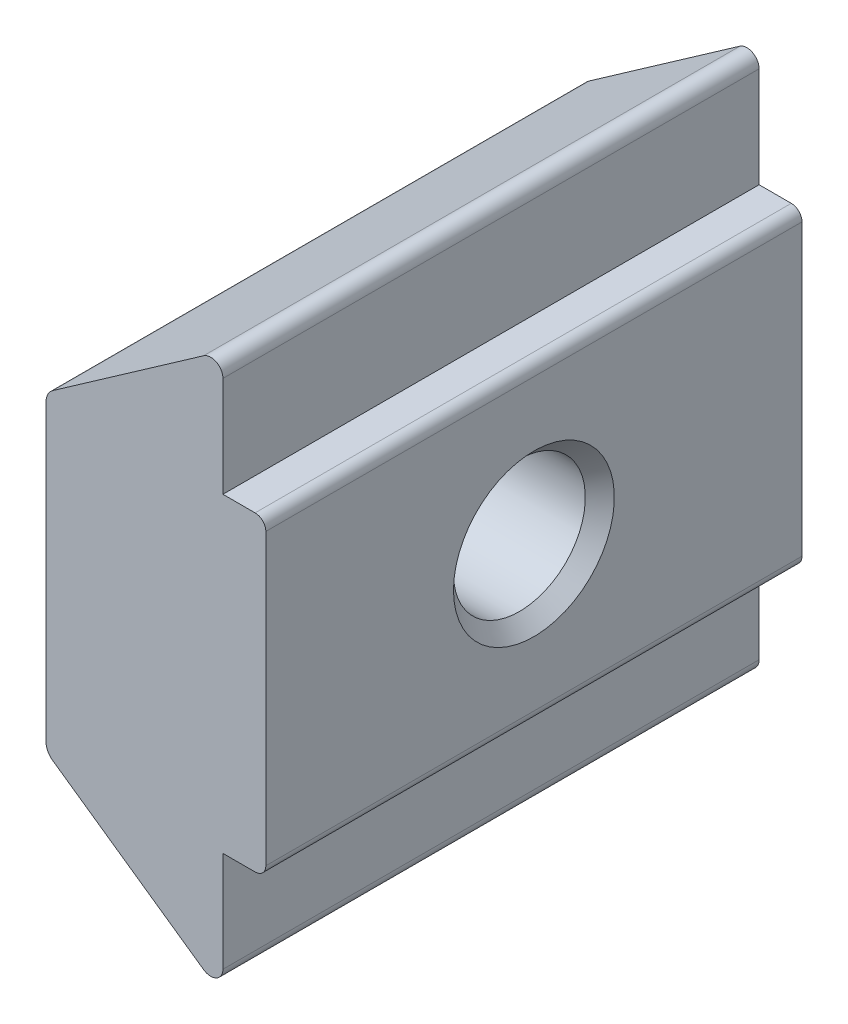
ISO-10303-21;
HEADER;
FILE_DESCRIPTION(('STEP AP214'),'2;1');
FILE_NAME('part.step','',(''),(''),'','','');
FILE_SCHEMA(('AUTOMOTIVE_DESIGN { 1 0 10303 214 1 1 1 1 }'));
ENDSEC;
DATA;
#1=APPLICATION_CONTEXT('core data for automotive mechanical design processes');
#2=APPLICATION_PROTOCOL_DEFINITION('international standard','automotive_design',2000,#1);
#3=PRODUCT_CONTEXT('',#1,'mechanical');
#4=PRODUCT('Part','Part','',(#3));
#5=PRODUCT_RELATED_PRODUCT_CATEGORY('part','',(#4));
#6=PRODUCT_DEFINITION_FORMATION('','',#4);
#7=PRODUCT_DEFINITION_CONTEXT('part definition',#1,'design');
#8=PRODUCT_DEFINITION('design','',#6,#7);
#9=PRODUCT_DEFINITION_SHAPE('','',#8);
#10=(LENGTH_UNIT() NAMED_UNIT(*) SI_UNIT(.MILLI.,.METRE.));
#11=(NAMED_UNIT(*) PLANE_ANGLE_UNIT() SI_UNIT($,.RADIAN.));
#12=(NAMED_UNIT(*) SI_UNIT($,.STERADIAN.) SOLID_ANGLE_UNIT());
#13=UNCERTAINTY_MEASURE_WITH_UNIT(LENGTH_MEASURE(1.E-05),#10,'distance_accuracy_value','');
#14=(GEOMETRIC_REPRESENTATION_CONTEXT(3) GLOBAL_UNCERTAINTY_ASSIGNED_CONTEXT((#13)) GLOBAL_UNIT_ASSIGNED_CONTEXT((#10,
#11,#12)) REPRESENTATION_CONTEXT('',''));
#15=CARTESIAN_POINT('',(0.,0.,0.));
#16=DIRECTION('',(0.,0.,1.));
#17=DIRECTION('',(1.,0.,0.));
#18=AXIS2_PLACEMENT_3D('',#15,#16,#17);
#19=CARTESIAN_POINT('',(-3.80000000000035,-2.74380333152817,5.));
#20=DIRECTION('',(0.,0.,-1.));
#21=DIRECTION('',(-1.,0.,0.));
#22=AXIS2_PLACEMENT_3D('',#19,#20,#21);
#23=CYLINDRICAL_SURFACE('',#22,0.299999999999655);
#24=DIRECTION('',(0.,0.,-1.));
#25=VECTOR('',#24,1.);
#26=CARTESIAN_POINT('',(-4.1,-2.743803331528,5.));
#27=LINE('',#26,#25);
#28=CARTESIAN_POINT('',(-4.1,-2.743803331528,5.));
#29=VERTEX_POINT('',#28);
#30=CARTESIAN_POINT('',(-4.1,-2.743803331528,-5.));
#31=VERTEX_POINT('',#30);
#32=EDGE_CURVE('E152',#29,#31,#27,.T.);
#33=ORIENTED_EDGE('',*,*,#32,.T.);
#34=CARTESIAN_POINT('',(-3.80000000000035,-2.74380333152817,-5.));
#35=DIRECTION('',(0.,0.,1.));
#36=DIRECTION('',(1.,0.,0.));
#37=AXIS2_PLACEMENT_3D('',#34,#35,#36);
#38=CIRCLE('',#37,0.299999999999655);
#39=CARTESIAN_POINT('',(-3.972038703309,-2.9895729076837,-5.));
#40=VERTEX_POINT('',#39);
#41=EDGE_CURVE('E146',#31,#40,#38,.T.);
#42=ORIENTED_EDGE('',*,*,#41,.T.);
#43=DIRECTION('',(0.,0.,-1.));
#44=VECTOR('',#43,1.);
#45=CARTESIAN_POINT('',(-3.972038703309,-2.9895729076837,5.));
#46=LINE('',#45,#44);
#47=CARTESIAN_POINT('',(-3.972038703309,-2.9895729076837,5.));
#48=VERTEX_POINT('',#47);
#49=EDGE_CURVE('E11',#48,#40,#46,.T.);
#50=ORIENTED_EDGE('',*,*,#49,.F.);
#51=CARTESIAN_POINT('',(-3.80000000000035,-2.74380333152817,5.));
#52=DIRECTION('',(0.,0.,1.));
#53=DIRECTION('',(1.,0.,0.));
#54=AXIS2_PLACEMENT_3D('',#51,#52,#53);
#55=CIRCLE('',#54,0.299999999999655);
#56=EDGE_CURVE('E193',#29,#48,#55,.T.);
#57=ORIENTED_EDGE('',*,*,#56,.F.);
#58=EDGE_LOOP('',(#33,#42,#50,#57));
#59=FACE_BOUND('',#58,.T.);
#60=ADVANCED_FACE('F34',(#59),#23,.T.);
#61=CARTESIAN_POINT('',(-3.972038703309,-2.9895729076837,5.));
#62=DIRECTION('',(0.573462344363338,0.819231920519034,0.));
#63=DIRECTION('',(-0.819231920519034,0.573462344363338,0.));
#64=AXIS2_PLACEMENT_3D('',#61,#62,#63);
#65=PLANE('',#64);
#66=ORIENTED_EDGE('',*,*,#49,.T.);
#67=DIRECTION('',(0.819231920519034,-0.573462344363338,0.));
#68=VECTOR('',#67,1.);
#69=CARTESIAN_POINT('',(-3.972038703309,-2.9895729076837,-5.));
#70=LINE('',#69,#68);
#71=CARTESIAN_POINT('',(-1.1589060402685,-4.9587657718121,-5.));
#72=VERTEX_POINT('',#71);
#73=EDGE_CURVE('E136',#40,#72,#70,.T.);
#74=ORIENTED_EDGE('',*,*,#73,.T.);
#75=DIRECTION('',(0.,0.,-1.));
#76=VECTOR('',#75,1.);
#77=CARTESIAN_POINT('',(-1.1589060402685,-4.9587657718121,5.));
#78=LINE('',#77,#76);
#79=CARTESIAN_POINT('',(-1.1589060402685,-4.9587657718121,5.));
#80=VERTEX_POINT('',#79);
#81=EDGE_CURVE('E41',#80,#72,#78,.T.);
#82=ORIENTED_EDGE('',*,*,#81,.F.);
#83=DIRECTION('',(0.819231920519034,-0.573462344363338,0.));
#84=VECTOR('',#83,1.);
#85=CARTESIAN_POINT('',(-3.972038703309,-2.9895729076837,5.));
#86=LINE('',#85,#84);
#87=EDGE_CURVE('E137',#48,#80,#86,.T.);
#88=ORIENTED_EDGE('',*,*,#87,.F.);
#89=EDGE_LOOP('',(#66,#74,#82,#88));
#90=FACE_BOUND('',#89,.T.);
#91=ADVANCED_FACE('F134',(#90),#65,.F.);
#92=CARTESIAN_POINT('',(-1.02809999999485,-4.77189846641082,5.));
#93=DIRECTION('',(0.,0.,-1.));
#94=DIRECTION('',(-1.,0.,0.));
#95=AXIS2_PLACEMENT_3D('',#92,#93,#94);
#96=CYLINDRICAL_SURFACE('',#95,0.228100000000009);
#97=ORIENTED_EDGE('',*,*,#81,.T.);
#98=CARTESIAN_POINT('',(-1.02809999999485,-4.77189846641082,-5.));
#99=DIRECTION('',(0.,0.,1.));
#100=DIRECTION('',(1.,0.,0.));
#101=AXIS2_PLACEMENT_3D('',#98,#99,#100);
#102=CIRCLE('',#101,0.228100000000009);
#103=CARTESIAN_POINT('',(-0.8,-4.7719,-5.));
#104=VERTEX_POINT('',#103);
#105=EDGE_CURVE('E150',#72,#104,#102,.T.);
#106=ORIENTED_EDGE('',*,*,#105,.T.);
#107=DIRECTION('',(0.,0.,-1.));
#108=VECTOR('',#107,1.);
#109=CARTESIAN_POINT('',(-0.8,-4.7719,5.));
#110=LINE('',#109,#108);
#111=CARTESIAN_POINT('',(-0.8,-4.7719,5.));
#112=VERTEX_POINT('',#111);
#113=EDGE_CURVE('E239',#112,#104,#110,.T.);
#114=ORIENTED_EDGE('',*,*,#113,.F.);
#115=CARTESIAN_POINT('',(-1.02809999999485,-4.77189846641082,5.));
#116=DIRECTION('',(0.,0.,1.));
#117=DIRECTION('',(1.,0.,0.));
#118=AXIS2_PLACEMENT_3D('',#115,#116,#117);
#119=CIRCLE('',#118,0.228100000000009);
#120=EDGE_CURVE('E196',#80,#112,#119,.T.);
#121=ORIENTED_EDGE('',*,*,#120,.F.);
#122=EDGE_LOOP('',(#97,#106,#114,#121));
#123=FACE_BOUND('',#122,.T.);
#124=ADVANCED_FACE('F242',(#123),#96,.T.);
#125=CARTESIAN_POINT('',(-0.8,-4.7719,5.));
#126=DIRECTION('',(-1.,0.,0.));
#127=DIRECTION('',(0.,0.,1.));
#128=AXIS2_PLACEMENT_3D('',#125,#126,#127);
#129=PLANE('',#128);
#130=ORIENTED_EDGE('',*,*,#113,.T.);
#131=DIRECTION('',(0.,1.,0.));
#132=VECTOR('',#131,1.);
#133=CARTESIAN_POINT('',(-0.8,-4.7719,-5.));
#134=LINE('',#133,#132);
#135=CARTESIAN_POINT('',(-0.8,-2.9,-5.));
#136=VERTEX_POINT('',#135);
#137=EDGE_CURVE('E161',#104,#136,#134,.T.);
#138=ORIENTED_EDGE('',*,*,#137,.T.);
#139=DIRECTION('',(0.,0.,-1.));
#140=VECTOR('',#139,1.);
#141=CARTESIAN_POINT('',(-0.8,-2.9,5.));
#142=LINE('',#141,#140);
#143=CARTESIAN_POINT('',(-0.8,-2.9,5.));
#144=VERTEX_POINT('',#143);
#145=EDGE_CURVE('E237',#144,#136,#142,.T.);
#146=ORIENTED_EDGE('',*,*,#145,.F.);
#147=DIRECTION('',(0.,1.,0.));
#148=VECTOR('',#147,1.);
#149=CARTESIAN_POINT('',(-0.8,-4.7719,5.));
#150=LINE('',#149,#148);
#151=EDGE_CURVE('E198',#112,#144,#150,.T.);
#152=ORIENTED_EDGE('',*,*,#151,.F.);
#153=EDGE_LOOP('',(#130,#138,#146,#152));
#154=FACE_BOUND('',#153,.T.);
#155=ADVANCED_FACE('F250',(#154),#129,.F.);
#156=CARTESIAN_POINT('',(-0.8,-2.9,5.));
#157=DIRECTION('',(0.,1.,0.));
#158=DIRECTION('',(0.,0.,1.));
#159=AXIS2_PLACEMENT_3D('',#156,#157,#158);
#160=PLANE('',#159);
#161=ORIENTED_EDGE('',*,*,#145,.T.);
#162=DIRECTION('',(1.,0.,0.));
#163=VECTOR('',#162,1.);
#164=CARTESIAN_POINT('',(-0.8,-2.9,-5.));
#165=LINE('',#164,#163);
#166=CARTESIAN_POINT('',(-0.2,-2.9,-5.));
#167=VERTEX_POINT('',#166);
#168=EDGE_CURVE('E164',#136,#167,#165,.T.);
#169=ORIENTED_EDGE('',*,*,#168,.T.);
#170=DIRECTION('',(0.,0.,-1.));
#171=VECTOR('',#170,1.);
#172=CARTESIAN_POINT('',(-0.2,-2.9,5.));
#173=LINE('',#172,#171);
#174=CARTESIAN_POINT('',(-0.2,-2.9,5.));
#175=VERTEX_POINT('',#174);
#176=EDGE_CURVE('E235',#175,#167,#173,.T.);
#177=ORIENTED_EDGE('',*,*,#176,.F.);
#178=DIRECTION('',(1.,0.,0.));
#179=VECTOR('',#178,1.);
#180=CARTESIAN_POINT('',(-0.8,-2.9,5.));
#181=LINE('',#180,#179);
#182=EDGE_CURVE('E200',#144,#175,#181,.T.);
#183=ORIENTED_EDGE('',*,*,#182,.F.);
#184=EDGE_LOOP('',(#161,#169,#177,#183));
#185=FACE_BOUND('',#184,.T.);
#186=ADVANCED_FACE('F253',(#185),#160,.F.);
#187=CARTESIAN_POINT('',(-0.200000000000016,-2.69999999999998,5.));
#188=DIRECTION('',(0.,0.,-1.));
#189=DIRECTION('',(-1.,0.,0.));
#190=AXIS2_PLACEMENT_3D('',#187,#188,#189);
#191=CYLINDRICAL_SURFACE('',#190,0.200000000000016);
#192=ORIENTED_EDGE('',*,*,#176,.T.);
#193=CARTESIAN_POINT('',(-0.200000000000016,-2.69999999999998,-5.));
#194=DIRECTION('',(0.,0.,1.));
#195=DIRECTION('',(1.,0.,0.));
#196=AXIS2_PLACEMENT_3D('',#193,#194,#195);
#197=CIRCLE('',#196,0.200000000000016);
#198=CARTESIAN_POINT('',(0.,-2.7,-5.));
#199=VERTEX_POINT('',#198);
#200=EDGE_CURVE('E167',#167,#199,#197,.T.);
#201=ORIENTED_EDGE('',*,*,#200,.T.);
#202=DIRECTION('',(0.,0.,-1.));
#203=VECTOR('',#202,1.);
#204=CARTESIAN_POINT('',(0.,-2.7,5.));
#205=LINE('',#204,#203);
#206=CARTESIAN_POINT('',(0.,-2.7,5.));
#207=VERTEX_POINT('',#206);
#208=EDGE_CURVE('E233',#207,#199,#205,.T.);
#209=ORIENTED_EDGE('',*,*,#208,.F.);
#210=CARTESIAN_POINT('',(-0.200000000000016,-2.69999999999998,5.));
#211=DIRECTION('',(0.,0.,1.));
#212=DIRECTION('',(1.,0.,0.));
#213=AXIS2_PLACEMENT_3D('',#210,#211,#212);
#214=CIRCLE('',#213,0.200000000000016);
#215=EDGE_CURVE('E202',#175,#207,#214,.T.);
#216=ORIENTED_EDGE('',*,*,#215,.F.);
#217=EDGE_LOOP('',(#192,#201,#209,#216));
#218=FACE_BOUND('',#217,.T.);
#219=ADVANCED_FACE('F258',(#218),#191,.T.);
#220=CARTESIAN_POINT('',(0.,-2.7,5.));
#221=DIRECTION('',(-1.,0.,0.));
#222=DIRECTION('',(0.,0.,1.));
#223=AXIS2_PLACEMENT_3D('',#220,#221,#222);
#224=PLANE('',#223);
#225=CARTESIAN_POINT('',(0.,0.,0.));
#226=DIRECTION('',(-1.,0.,0.));
#227=DIRECTION('',(0.,0.,1.));
#228=AXIS2_PLACEMENT_3D('',#225,#226,#227);
#229=CIRCLE('',#228,1.5);
#230=CARTESIAN_POINT('',(0.,0.,1.5));
#231=VERTEX_POINT('',#230);
#232=EDGE_CURVE('E407',#231,#231,#229,.T.);
#233=ORIENTED_EDGE('',*,*,#232,.T.);
#234=EDGE_LOOP('',(#233));
#235=FACE_BOUND('',#234,.T.);
#236=ORIENTED_EDGE('',*,*,#208,.T.);
#237=DIRECTION('',(0.,1.,0.));
#238=VECTOR('',#237,1.);
#239=CARTESIAN_POINT('',(0.,-2.7,-5.));
#240=LINE('',#239,#238);
#241=CARTESIAN_POINT('',(0.,2.7,-5.));
#242=VERTEX_POINT('',#241);
#243=EDGE_CURVE('E170',#199,#242,#240,.T.);
#244=ORIENTED_EDGE('',*,*,#243,.T.);
#245=DIRECTION('',(0.,0.,-1.));
#246=VECTOR('',#245,1.);
#247=CARTESIAN_POINT('',(0.,2.7,5.));
#248=LINE('',#247,#246);
#249=CARTESIAN_POINT('',(0.,2.7,5.));
#250=VERTEX_POINT('',#249);
#251=EDGE_CURVE('E231',#250,#242,#248,.T.);
#252=ORIENTED_EDGE('',*,*,#251,.F.);
#253=DIRECTION('',(0.,1.,0.));
#254=VECTOR('',#253,1.);
#255=CARTESIAN_POINT('',(0.,-2.7,5.));
#256=LINE('',#255,#254);
#257=EDGE_CURVE('E204',#207,#250,#256,.T.);
#258=ORIENTED_EDGE('',*,*,#257,.F.);
#259=EDGE_LOOP('',(#236,#244,#252,#258));
#260=FACE_BOUND('',#259,.T.);
#261=ADVANCED_FACE('F264',(#235,#260),#224,.F.);
#262=CARTESIAN_POINT('',(-0.200000000000016,2.69999999999998,5.));
#263=DIRECTION('',(0.,0.,-1.));
#264=DIRECTION('',(-1.,0.,0.));
#265=AXIS2_PLACEMENT_3D('',#262,#263,#264);
#266=CYLINDRICAL_SURFACE('',#265,0.200000000000016);
#267=ORIENTED_EDGE('',*,*,#251,.T.);
#268=CARTESIAN_POINT('',(-0.200000000000016,2.69999999999998,-5.));
#269=DIRECTION('',(0.,0.,1.));
#270=DIRECTION('',(1.,0.,0.));
#271=AXIS2_PLACEMENT_3D('',#268,#269,#270);
#272=CIRCLE('',#271,0.200000000000016);
#273=CARTESIAN_POINT('',(-0.2,2.9,-5.));
#274=VERTEX_POINT('',#273);
#275=EDGE_CURVE('E173',#242,#274,#272,.T.);
#276=ORIENTED_EDGE('',*,*,#275,.T.);
#277=DIRECTION('',(0.,0.,-1.));
#278=VECTOR('',#277,1.);
#279=CARTESIAN_POINT('',(-0.2,2.9,5.));
#280=LINE('',#279,#278);
#281=CARTESIAN_POINT('',(-0.2,2.9,5.));
#282=VERTEX_POINT('',#281);
#283=EDGE_CURVE('E229',#282,#274,#280,.T.);
#284=ORIENTED_EDGE('',*,*,#283,.F.);
#285=CARTESIAN_POINT('',(-0.200000000000016,2.69999999999998,5.));
#286=DIRECTION('',(0.,0.,1.));
#287=DIRECTION('',(1.,0.,0.));
#288=AXIS2_PLACEMENT_3D('',#285,#286,#287);
#289=CIRCLE('',#288,0.200000000000016);
#290=EDGE_CURVE('E206',#250,#282,#289,.T.);
#291=ORIENTED_EDGE('',*,*,#290,.F.);
#292=EDGE_LOOP('',(#267,#276,#284,#291));
#293=FACE_BOUND('',#292,.T.);
#294=ADVANCED_FACE('F268',(#293),#266,.T.);
#295=CARTESIAN_POINT('',(-0.2,2.9,5.));
#296=DIRECTION('',(0.,-1.,0.));
#297=DIRECTION('',(0.,0.,-1.));
#298=AXIS2_PLACEMENT_3D('',#295,#296,#297);
#299=PLANE('',#298);
#300=ORIENTED_EDGE('',*,*,#283,.T.);
#301=DIRECTION('',(-1.,0.,0.));
#302=VECTOR('',#301,1.);
#303=CARTESIAN_POINT('',(-0.2,2.9,-5.));
#304=LINE('',#303,#302);
#305=CARTESIAN_POINT('',(-0.8,2.9,-5.));
#306=VERTEX_POINT('',#305);
#307=EDGE_CURVE('E176',#274,#306,#304,.T.);
#308=ORIENTED_EDGE('',*,*,#307,.T.);
#309=DIRECTION('',(0.,0.,-1.));
#310=VECTOR('',#309,1.);
#311=CARTESIAN_POINT('',(-0.8,2.9,5.));
#312=LINE('',#311,#310);
#313=CARTESIAN_POINT('',(-0.8,2.9,5.));
#314=VERTEX_POINT('',#313);
#315=EDGE_CURVE('E227',#314,#306,#312,.T.);
#316=ORIENTED_EDGE('',*,*,#315,.F.);
#317=DIRECTION('',(-1.,0.,0.));
#318=VECTOR('',#317,1.);
#319=CARTESIAN_POINT('',(-0.2,2.9,5.));
#320=LINE('',#319,#318);
#321=EDGE_CURVE('E208',#282,#314,#320,.T.);
#322=ORIENTED_EDGE('',*,*,#321,.F.);
#323=EDGE_LOOP('',(#300,#308,#316,#322));
#324=FACE_BOUND('',#323,.T.);
#325=ADVANCED_FACE('F273',(#324),#299,.F.);
#326=CARTESIAN_POINT('',(-0.8,2.9,5.));
#327=DIRECTION('',(-1.,0.,0.));
#328=DIRECTION('',(0.,0.,1.));
#329=AXIS2_PLACEMENT_3D('',#326,#327,#328);
#330=PLANE('',#329);
#331=ORIENTED_EDGE('',*,*,#315,.T.);
#332=DIRECTION('',(0.,1.,0.));
#333=VECTOR('',#332,1.);
#334=CARTESIAN_POINT('',(-0.8,2.9,-5.));
#335=LINE('',#334,#333);
#336=CARTESIAN_POINT('',(-0.8,4.7719,-5.));
#337=VERTEX_POINT('',#336);
#338=EDGE_CURVE('E179',#306,#337,#335,.T.);
#339=ORIENTED_EDGE('',*,*,#338,.T.);
#340=DIRECTION('',(0.,0.,-1.));
#341=VECTOR('',#340,1.);
#342=CARTESIAN_POINT('',(-0.8,4.7719,5.));
#343=LINE('',#342,#341);
#344=CARTESIAN_POINT('',(-0.8,4.7719,5.));
#345=VERTEX_POINT('',#344);
#346=EDGE_CURVE('E225',#345,#337,#343,.T.);
#347=ORIENTED_EDGE('',*,*,#346,.F.);
#348=DIRECTION('',(0.,1.,0.));
#349=VECTOR('',#348,1.);
#350=CARTESIAN_POINT('',(-0.8,2.9,5.));
#351=LINE('',#350,#349);
#352=EDGE_CURVE('E210',#314,#345,#351,.T.);
#353=ORIENTED_EDGE('',*,*,#352,.F.);
#354=EDGE_LOOP('',(#331,#339,#347,#353));
#355=FACE_BOUND('',#354,.T.);
#356=ADVANCED_FACE('F279',(#355),#330,.F.);
#357=CARTESIAN_POINT('',(-1.02809999999485,4.77189846641082,5.));
#358=DIRECTION('',(0.,0.,-1.));
#359=DIRECTION('',(-1.,0.,0.));
#360=AXIS2_PLACEMENT_3D('',#357,#358,#359);
#361=CYLINDRICAL_SURFACE('',#360,0.228100000000009);
#362=ORIENTED_EDGE('',*,*,#346,.T.);
#363=CARTESIAN_POINT('',(-1.02809999999485,4.77189846641082,-5.));
#364=DIRECTION('',(0.,0.,1.));
#365=DIRECTION('',(1.,0.,0.));
#366=AXIS2_PLACEMENT_3D('',#363,#364,#365);
#367=CIRCLE('',#366,0.228100000000009);
#368=CARTESIAN_POINT('',(-1.1589060402685,4.9587657718121,-5.));
#369=VERTEX_POINT('',#368);
#370=EDGE_CURVE('E182',#337,#369,#367,.T.);
#371=ORIENTED_EDGE('',*,*,#370,.T.);
#372=DIRECTION('',(0.,0.,-1.));
#373=VECTOR('',#372,1.);
#374=CARTESIAN_POINT('',(-1.1589060402685,4.9587657718121,5.));
#375=LINE('',#374,#373);
#376=CARTESIAN_POINT('',(-1.1589060402685,4.9587657718121,5.));
#377=VERTEX_POINT('',#376);
#378=EDGE_CURVE('E223',#377,#369,#375,.T.);
#379=ORIENTED_EDGE('',*,*,#378,.F.);
#380=CARTESIAN_POINT('',(-1.02809999999485,4.77189846641082,5.));
#381=DIRECTION('',(0.,0.,1.));
#382=DIRECTION('',(1.,0.,0.));
#383=AXIS2_PLACEMENT_3D('',#380,#381,#382);
#384=CIRCLE('',#383,0.228100000000009);
#385=EDGE_CURVE('E212',#345,#377,#384,.T.);
#386=ORIENTED_EDGE('',*,*,#385,.F.);
#387=EDGE_LOOP('',(#362,#371,#379,#386));
#388=FACE_BOUND('',#387,.T.);
#389=ADVANCED_FACE('F283',(#388),#361,.T.);
#390=CARTESIAN_POINT('',(-1.1589060402685,4.9587657718121,5.));
#391=DIRECTION('',(0.573462344363338,-0.819231920519034,0.));
#392=DIRECTION('',(0.819231920519034,0.573462344363338,0.));
#393=AXIS2_PLACEMENT_3D('',#390,#391,#392);
#394=PLANE('',#393);
#395=ORIENTED_EDGE('',*,*,#378,.T.);
#396=DIRECTION('',(-0.819231920519034,-0.573462344363338,0.));
#397=VECTOR('',#396,1.);
#398=CARTESIAN_POINT('',(-1.1589060402685,4.9587657718121,-5.));
#399=LINE('',#398,#397);
#400=CARTESIAN_POINT('',(-3.972038703309,2.9895729076837,-5.));
#401=VERTEX_POINT('',#400);
#402=EDGE_CURVE('E185',#369,#401,#399,.T.);
#403=ORIENTED_EDGE('',*,*,#402,.T.);
#404=DIRECTION('',(0.,0.,-1.));
#405=VECTOR('',#404,1.);
#406=CARTESIAN_POINT('',(-3.972038703309,2.9895729076837,5.));
#407=LINE('',#406,#405);
#408=CARTESIAN_POINT('',(-3.972038703309,2.9895729076837,5.));
#409=VERTEX_POINT('',#408);
#410=EDGE_CURVE('E221',#409,#401,#407,.T.);
#411=ORIENTED_EDGE('',*,*,#410,.F.);
#412=DIRECTION('',(-0.819231920519034,-0.573462344363338,0.));
#413=VECTOR('',#412,1.);
#414=CARTESIAN_POINT('',(-1.1589060402685,4.9587657718121,5.));
#415=LINE('',#414,#413);
#416=EDGE_CURVE('E214',#377,#409,#415,.T.);
#417=ORIENTED_EDGE('',*,*,#416,.F.);
#418=EDGE_LOOP('',(#395,#403,#411,#417));
#419=FACE_BOUND('',#418,.T.);
#420=ADVANCED_FACE('F288',(#419),#394,.F.);
#421=CARTESIAN_POINT('',(-3.80000000000035,2.74380333152817,5.));
#422=DIRECTION('',(0.,0.,-1.));
#423=DIRECTION('',(-1.,0.,0.));
#424=AXIS2_PLACEMENT_3D('',#421,#422,#423);
#425=CYLINDRICAL_SURFACE('',#424,0.299999999999655);
#426=ORIENTED_EDGE('',*,*,#410,.T.);
#427=CARTESIAN_POINT('',(-3.80000000000035,2.74380333152817,-5.));
#428=DIRECTION('',(0.,0.,1.));
#429=DIRECTION('',(1.,0.,0.));
#430=AXIS2_PLACEMENT_3D('',#427,#428,#429);
#431=CIRCLE('',#430,0.299999999999655);
#432=CARTESIAN_POINT('',(-4.1,2.743803331528,-5.));
#433=VERTEX_POINT('',#432);
#434=EDGE_CURVE('E188',#401,#433,#431,.T.);
#435=ORIENTED_EDGE('',*,*,#434,.T.);
#436=DIRECTION('',(0.,0.,-1.));
#437=VECTOR('',#436,1.);
#438=CARTESIAN_POINT('',(-4.1,2.743803331528,5.));
#439=LINE('',#438,#437);
#440=CARTESIAN_POINT('',(-4.1,2.743803331528,5.));
#441=VERTEX_POINT('',#440);
#442=EDGE_CURVE('E219',#441,#433,#439,.T.);
#443=ORIENTED_EDGE('',*,*,#442,.F.);
#444=CARTESIAN_POINT('',(-3.80000000000035,2.74380333152817,5.));
#445=DIRECTION('',(0.,0.,1.));
#446=DIRECTION('',(1.,0.,0.));
#447=AXIS2_PLACEMENT_3D('',#444,#445,#446);
#448=CIRCLE('',#447,0.299999999999655);
#449=EDGE_CURVE('E53',#409,#441,#448,.T.);
#450=ORIENTED_EDGE('',*,*,#449,.F.);
#451=EDGE_LOOP('',(#426,#435,#443,#450));
#452=FACE_BOUND('',#451,.T.);
#453=ADVANCED_FACE('F291',(#452),#425,.T.);
#454=CARTESIAN_POINT('',(-4.1,2.743803331528,5.));
#455=DIRECTION('',(1.,0.,0.));
#456=DIRECTION('',(0.,0.,-1.));
#457=AXIS2_PLACEMENT_3D('',#454,#455,#456);
#458=PLANE('',#457);
#459=CARTESIAN_POINT('',(-4.1,0.,0.));
#460=DIRECTION('',(-1.,0.,0.));
#461=DIRECTION('',(0.,0.,1.));
#462=AXIS2_PLACEMENT_3D('',#459,#460,#461);
#463=CIRCLE('',#462,1.5);
#464=CARTESIAN_POINT('',(-4.1,0.,1.5));
#465=VERTEX_POINT('',#464);
#466=EDGE_CURVE('E153',#465,#465,#463,.T.);
#467=ORIENTED_EDGE('',*,*,#466,.F.);
#468=EDGE_LOOP('',(#467));
#469=FACE_BOUND('',#468,.T.);
#470=ORIENTED_EDGE('',*,*,#442,.T.);
#471=DIRECTION('',(0.,-1.,0.));
#472=VECTOR('',#471,1.);
#473=CARTESIAN_POINT('',(-4.1,2.743803331528,-5.));
#474=LINE('',#473,#472);
#475=EDGE_CURVE('E191',#433,#31,#474,.T.);
#476=ORIENTED_EDGE('',*,*,#475,.T.);
#477=ORIENTED_EDGE('',*,*,#32,.F.);
#478=DIRECTION('',(0.,-1.,0.));
#479=VECTOR('',#478,1.);
#480=CARTESIAN_POINT('',(-4.1,2.743803331528,5.));
#481=LINE('',#480,#479);
#482=EDGE_CURVE('E48',#441,#29,#481,.T.);
#483=ORIENTED_EDGE('',*,*,#482,.F.);
#484=EDGE_LOOP('',(#470,#476,#477,#483));
#485=FACE_BOUND('',#484,.T.);
#486=ADVANCED_FACE('F293',(#469,#485),#458,.F.);
#487=CARTESIAN_POINT('',(-3.80000000000035,-2.74380333152817,5.));
#488=DIRECTION('',(0.,0.,1.));
#489=DIRECTION('',(1.,0.,0.));
#490=AXIS2_PLACEMENT_3D('',#487,#488,#489);
#491=PLANE('',#490);
#492=ORIENTED_EDGE('',*,*,#56,.T.);
#493=ORIENTED_EDGE('',*,*,#87,.T.);
#494=ORIENTED_EDGE('',*,*,#120,.T.);
#495=ORIENTED_EDGE('',*,*,#151,.T.);
#496=ORIENTED_EDGE('',*,*,#182,.T.);
#497=ORIENTED_EDGE('',*,*,#215,.T.);
#498=ORIENTED_EDGE('',*,*,#257,.T.);
#499=ORIENTED_EDGE('',*,*,#290,.T.);
#500=ORIENTED_EDGE('',*,*,#321,.T.);
#501=ORIENTED_EDGE('',*,*,#352,.T.);
#502=ORIENTED_EDGE('',*,*,#385,.T.);
#503=ORIENTED_EDGE('',*,*,#416,.T.);
#504=ORIENTED_EDGE('',*,*,#449,.T.);
#505=ORIENTED_EDGE('',*,*,#482,.T.);
#506=EDGE_LOOP('',(#492,#493,#494,#495,#496,#497,#498,#499,#500,#501,#502,#503,#504,#505));
#507=FACE_BOUND('',#506,.T.);
#508=ADVANCED_FACE('F245',(#507),#491,.T.);
#509=CARTESIAN_POINT('',(-3.80000000000035,-2.74380333152817,-5.));
#510=DIRECTION('',(0.,0.,1.));
#511=DIRECTION('',(1.,0.,0.));
#512=AXIS2_PLACEMENT_3D('',#509,#510,#511);
#513=PLANE('',#512);
#514=ORIENTED_EDGE('',*,*,#41,.F.);
#515=ORIENTED_EDGE('',*,*,#475,.F.);
#516=ORIENTED_EDGE('',*,*,#434,.F.);
#517=ORIENTED_EDGE('',*,*,#402,.F.);
#518=ORIENTED_EDGE('',*,*,#370,.F.);
#519=ORIENTED_EDGE('',*,*,#338,.F.);
#520=ORIENTED_EDGE('',*,*,#307,.F.);
#521=ORIENTED_EDGE('',*,*,#275,.F.);
#522=ORIENTED_EDGE('',*,*,#243,.F.);
#523=ORIENTED_EDGE('',*,*,#200,.F.);
#524=ORIENTED_EDGE('',*,*,#168,.F.);
#525=ORIENTED_EDGE('',*,*,#137,.F.);
#526=ORIENTED_EDGE('',*,*,#105,.F.);
#527=ORIENTED_EDGE('',*,*,#73,.F.);
#528=EDGE_LOOP('',(#514,#515,#516,#517,#518,#519,#520,#521,#522,#523,#524,#525,#526,#527));
#529=FACE_BOUND('',#528,.T.);
#530=ADVANCED_FACE('F144',(#529),#513,.F.);
#531=CARTESIAN_POINT('',(-3.8295,0.,0.));
#532=DIRECTION('',(-1.,0.,0.));
#533=DIRECTION('',(0.,0.,1.));
#534=AXIS2_PLACEMENT_3D('',#531,#532,#533);
#535=CONICAL_SURFACE('',#534,1.2295,0.785398163397448);
#536=ORIENTED_EDGE('',*,*,#466,.T.);
#537=EDGE_LOOP('',(#536));
#538=FACE_BOUND('',#537,.T.);
#539=CARTESIAN_POINT('',(-3.8295,0.,0.));
#540=DIRECTION('',(-1.,0.,0.));
#541=DIRECTION('',(0.,0.,1.));
#542=AXIS2_PLACEMENT_3D('',#539,#540,#541);
#543=CIRCLE('',#542,1.2295);
#544=CARTESIAN_POINT('',(-3.8295,0.,1.2295));
#545=VERTEX_POINT('',#544);
#546=EDGE_CURVE('E156',#545,#545,#543,.T.);
#547=ORIENTED_EDGE('',*,*,#546,.F.);
#548=EDGE_LOOP('',(#547));
#549=FACE_BOUND('',#548,.T.);
#550=ADVANCED_FACE('F357',(#538,#549),#535,.F.);
#551=CARTESIAN_POINT('',(0.,0.,0.));
#552=DIRECTION('',(-1.,0.,0.));
#553=DIRECTION('',(0.,0.,1.));
#554=AXIS2_PLACEMENT_3D('',#551,#552,#553);
#555=CYLINDRICAL_SURFACE('',#554,1.2295);
#556=ORIENTED_EDGE('',*,*,#546,.T.);
#557=EDGE_LOOP('',(#556));
#558=FACE_BOUND('',#557,.T.);
#559=CARTESIAN_POINT('',(-0.2705,0.,0.));
#560=DIRECTION('',(-1.,0.,0.));
#561=DIRECTION('',(0.,0.,1.));
#562=AXIS2_PLACEMENT_3D('',#559,#560,#561);
#563=CIRCLE('',#562,1.2295);
#564=CARTESIAN_POINT('',(-0.2705,0.,1.2295));
#565=VERTEX_POINT('',#564);
#566=EDGE_CURVE('E404',#565,#565,#563,.T.);
#567=ORIENTED_EDGE('',*,*,#566,.F.);
#568=EDGE_LOOP('',(#567));
#569=FACE_BOUND('',#568,.T.);
#570=ADVANCED_FACE('F377',(#558,#569),#555,.F.);
#571=CARTESIAN_POINT('',(0.,0.,0.));
#572=DIRECTION('',(1.,0.,0.));
#573=DIRECTION('',(0.,0.,-1.));
#574=AXIS2_PLACEMENT_3D('',#571,#572,#573);
#575=CONICAL_SURFACE('',#574,1.5,0.785398163397449);
#576=ORIENTED_EDGE('',*,*,#566,.T.);
#577=EDGE_LOOP('',(#576));
#578=FACE_BOUND('',#577,.T.);
#579=ORIENTED_EDGE('',*,*,#232,.F.);
#580=EDGE_LOOP('',(#579));
#581=FACE_BOUND('',#580,.T.);
#582=ADVANCED_FACE('F387',(#578,#581),#575,.F.);
#583=CLOSED_SHELL('',(#60,#91,#124,#155,#186,#219,#261,#294,#325,#356,#389,#420,#453,#486,#508,
#530,#550,#570,#582));
#584=MANIFOLD_SOLID_BREP('B2',#583);
#585=ADVANCED_BREP_SHAPE_REPRESENTATION('',(#18,#584),#14);
#586=SHAPE_DEFINITION_REPRESENTATION(#9,#585);
ENDSEC;
END-ISO-10303-21;
